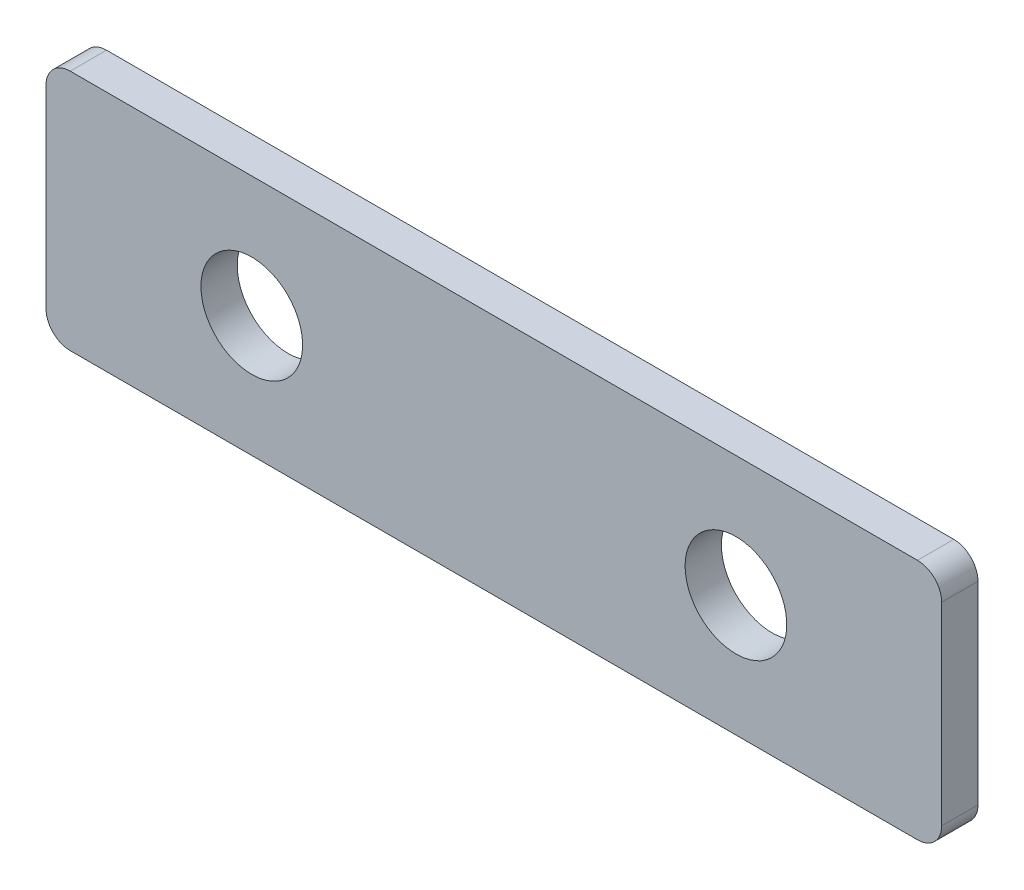
ISO-10303-21;
HEADER;
FILE_DESCRIPTION(('STEP AP214'),'2;1');
FILE_NAME('part.step','',(''),(''),'','','');
FILE_SCHEMA(('AUTOMOTIVE_DESIGN { 1 0 10303 214 1 1 1 1 }'));
ENDSEC;
DATA;
#1=APPLICATION_CONTEXT('core data for automotive mechanical design processes');
#2=APPLICATION_PROTOCOL_DEFINITION('international standard','automotive_design',2000,#1);
#3=PRODUCT_CONTEXT('',#1,'mechanical');
#4=PRODUCT('Part','Part','',(#3));
#5=PRODUCT_RELATED_PRODUCT_CATEGORY('part','',(#4));
#6=PRODUCT_DEFINITION_FORMATION('','',#4);
#7=PRODUCT_DEFINITION_CONTEXT('part definition',#1,'design');
#8=PRODUCT_DEFINITION('design','',#6,#7);
#9=PRODUCT_DEFINITION_SHAPE('','',#8);
#10=(LENGTH_UNIT() NAMED_UNIT(*) SI_UNIT(.MILLI.,.METRE.));
#11=(NAMED_UNIT(*) PLANE_ANGLE_UNIT() SI_UNIT($,.RADIAN.));
#12=(NAMED_UNIT(*) SI_UNIT($,.STERADIAN.) SOLID_ANGLE_UNIT());
#13=UNCERTAINTY_MEASURE_WITH_UNIT(LENGTH_MEASURE(1.E-05),#10,'distance_accuracy_value','');
#14=(GEOMETRIC_REPRESENTATION_CONTEXT(3) GLOBAL_UNCERTAINTY_ASSIGNED_CONTEXT((#13)) GLOBAL_UNIT_ASSIGNED_CONTEXT((#10,
#11,#12)) REPRESENTATION_CONTEXT('',''));
#15=CARTESIAN_POINT('',(0.,0.,0.));
#16=DIRECTION('',(0.,0.,1.));
#17=DIRECTION('',(1.,0.,0.));
#18=AXIS2_PLACEMENT_3D('',#15,#16,#17);
#19=CARTESIAN_POINT('',(17.4999999999999,3.99999999999973,1.5));
#20=DIRECTION('',(0.,0.,-0.999999999999995));
#21=DIRECTION('',(-1.,0.,0.));
#22=AXIS2_PLACEMENT_3D('',#19,#20,#21);
#23=PLANE('',#22);
#24=CARTESIAN_POINT('',(17.4999999999999,3.99999999999973,1.5));
#25=DIRECTION('',(0.,0.,0.999999999999995));
#26=DIRECTION('',(-1.,0.,0.));
#27=AXIS2_PLACEMENT_3D('',#24,#25,#26);
#28=CIRCLE('',#27,1.);
#29=CARTESIAN_POINT('',(18.4999999999999,3.99999999999964,1.49999999999986));
#30=VERTEX_POINT('',#29);
#31=CARTESIAN_POINT('',(17.5,4.99999999999973,1.5));
#32=VERTEX_POINT('',#31);
#33=EDGE_CURVE('E142',#30,#32,#28,.T.);
#34=ORIENTED_EDGE('',*,*,#33,.T.);
#35=DIRECTION('',(-1.,0.,0.));
#36=VECTOR('',#35,1.);
#37=CARTESIAN_POINT('',(-17.5,5.00000000000009,1.49999999999992));
#38=LINE('',#37,#36);
#39=CARTESIAN_POINT('',(-17.5,5.00000000000009,1.49999999999992));
#40=VERTEX_POINT('',#39);
#41=EDGE_CURVE('E90',#32,#40,#38,.T.);
#42=ORIENTED_EDGE('',*,*,#41,.T.);
#43=CARTESIAN_POINT('',(-17.5000000000002,4.00000000000009,1.5));
#44=DIRECTION('',(0.,0.,0.999999999999995));
#45=DIRECTION('',(-1.,0.,0.));
#46=AXIS2_PLACEMENT_3D('',#43,#44,#45);
#47=CIRCLE('',#46,1.);
#48=CARTESIAN_POINT('',(-18.5000000000002,3.99999999999992,1.50000000000003));
#49=VERTEX_POINT('',#48);
#50=EDGE_CURVE('E157',#40,#49,#47,.T.);
#51=ORIENTED_EDGE('',*,*,#50,.T.);
#52=DIRECTION('',(0.,-0.999999999999999,0.));
#53=VECTOR('',#52,1.);
#54=CARTESIAN_POINT('',(-18.5000000000001,-4.00000000000009,1.50000000000022));
#55=LINE('',#54,#53);
#56=CARTESIAN_POINT('',(-18.5000000000001,-4.00000000000009,1.50000000000022));
#57=VERTEX_POINT('',#56);
#58=EDGE_CURVE('E170',#49,#57,#55,.T.);
#59=ORIENTED_EDGE('',*,*,#58,.T.);
#60=CARTESIAN_POINT('',(-17.5000000000001,-3.99999999999992,1.50000000000008));
#61=DIRECTION('',(0.,0.,0.999999999999995));
#62=DIRECTION('',(-1.,0.,0.));
#63=AXIS2_PLACEMENT_3D('',#60,#61,#62);
#64=CIRCLE('',#63,1.);
#65=CARTESIAN_POINT('',(-17.5,-4.99999999999992,1.5));
#66=VERTEX_POINT('',#65);
#67=EDGE_CURVE('E109',#57,#66,#64,.T.);
#68=ORIENTED_EDGE('',*,*,#67,.T.);
#69=DIRECTION('',(1.,0.,0.));
#70=VECTOR('',#69,1.);
#71=CARTESIAN_POINT('',(-17.5,-4.99999999999992,1.5));
#72=LINE('',#71,#70);
#73=CARTESIAN_POINT('',(17.5,-5.00000000000028,1.50000000000008));
#74=VERTEX_POINT('',#73);
#75=EDGE_CURVE('E103',#66,#74,#72,.T.);
#76=ORIENTED_EDGE('',*,*,#75,.T.);
#77=CARTESIAN_POINT('',(17.5,-4.00000000000028,1.50000000000008));
#78=DIRECTION('',(0.,0.,0.999999999999995));
#79=DIRECTION('',(-1.,0.,0.));
#80=AXIS2_PLACEMENT_3D('',#77,#78,#79);
#81=CIRCLE('',#80,1.);
#82=CARTESIAN_POINT('',(18.5,-4.00000000000036,1.50000000000005));
#83=VERTEX_POINT('',#82);
#84=EDGE_CURVE('E107',#74,#83,#81,.T.);
#85=ORIENTED_EDGE('',*,*,#84,.T.);
#86=DIRECTION('',(0.,0.999999999999999,0.));
#87=VECTOR('',#86,1.);
#88=CARTESIAN_POINT('',(18.5,-4.00000000000036,1.50000000000005));
#89=LINE('',#88,#87);
#90=EDGE_CURVE('E47',#83,#30,#89,.T.);
#91=ORIENTED_EDGE('',*,*,#90,.T.);
#92=EDGE_LOOP('',(#34,#42,#51,#59,#68,#76,#85,#91));
#93=FACE_BOUND('',#92,.T.);
#94=CARTESIAN_POINT('',(-10.,0.,1.50000000000008));
#95=DIRECTION('',(0.,0.,0.999999999999995));
#96=DIRECTION('',(1.,0.,0.));
#97=AXIS2_PLACEMENT_3D('',#94,#95,#96);
#98=CIRCLE('',#97,2.1);
#99=CARTESIAN_POINT('',(-12.1,0.,1.50000000000008));
#100=VERTEX_POINT('',#99);
#101=EDGE_CURVE('E131',#100,#100,#98,.T.);
#102=ORIENTED_EDGE('',*,*,#101,.F.);
#103=EDGE_LOOP('',(#102));
#104=FACE_BOUND('',#103,.T.);
#105=CARTESIAN_POINT('',(10.,0.,1.5));
#106=DIRECTION('',(0.,0.,0.999999999999995));
#107=DIRECTION('',(1.,0.,0.));
#108=AXIS2_PLACEMENT_3D('',#105,#106,#107);
#109=CIRCLE('',#108,2.1);
#110=CARTESIAN_POINT('',(7.9,0.,1.5));
#111=VERTEX_POINT('',#110);
#112=EDGE_CURVE('E179',#111,#111,#109,.T.);
#113=ORIENTED_EDGE('',*,*,#112,.F.);
#114=EDGE_LOOP('',(#113));
#115=FACE_BOUND('',#114,.T.);
#116=ADVANCED_FACE('F30',(#93,#104,#115),#23,.F.);
#117=CARTESIAN_POINT('',(17.4999999999999,3.99999999999967,0.));
#118=DIRECTION('',(0.,0.,-0.999999999999995));
#119=DIRECTION('',(-1.,0.,0.));
#120=AXIS2_PLACEMENT_3D('',#117,#118,#119);
#121=PLANE('',#120);
#122=CARTESIAN_POINT('',(-10.,-1.66533453693773E-13,0.));
#123=DIRECTION('',(0.,0.,0.999999999999995));
#124=DIRECTION('',(1.,0.,0.));
#125=AXIS2_PLACEMENT_3D('',#122,#123,#124);
#126=CIRCLE('',#125,2.1);
#127=CARTESIAN_POINT('',(-12.1,0.,0.));
#128=VERTEX_POINT('',#127);
#129=EDGE_CURVE('E176',#128,#128,#126,.T.);
#130=ORIENTED_EDGE('',*,*,#129,.T.);
#131=EDGE_LOOP('',(#130));
#132=FACE_BOUND('',#131,.T.);
#133=CARTESIAN_POINT('',(17.4999999999999,3.99999999999967,0.));
#134=DIRECTION('',(0.,0.,0.999999999999995));
#135=DIRECTION('',(-1.,0.,0.));
#136=AXIS2_PLACEMENT_3D('',#133,#134,#135);
#137=CIRCLE('',#136,1.);
#138=CARTESIAN_POINT('',(18.4999999999999,3.99999999999975,-1.38777878078145E-13));
#139=VERTEX_POINT('',#138);
#140=CARTESIAN_POINT('',(17.5,4.99999999999967,0.));
#141=VERTEX_POINT('',#140);
#142=EDGE_CURVE('E127',#139,#141,#137,.T.);
#143=ORIENTED_EDGE('',*,*,#142,.F.);
#144=DIRECTION('',(0.,0.999999999999999,0.));
#145=VECTOR('',#144,1.);
#146=CARTESIAN_POINT('',(18.5,-4.00000000000025,0.));
#147=LINE('',#146,#145);
#148=CARTESIAN_POINT('',(18.5,-4.00000000000025,0.));
#149=VERTEX_POINT('',#148);
#150=EDGE_CURVE('E82',#149,#139,#147,.T.);
#151=ORIENTED_EDGE('',*,*,#150,.F.);
#152=CARTESIAN_POINT('',(17.5,-4.00000000000034,1.17961196366423E-13));
#153=DIRECTION('',(0.,0.,0.999999999999995));
#154=DIRECTION('',(-1.,0.,0.));
#155=AXIS2_PLACEMENT_3D('',#152,#153,#154);
#156=CIRCLE('',#155,1.);
#157=CARTESIAN_POINT('',(17.5,-5.00000000000034,0.));
#158=VERTEX_POINT('',#157);
#159=EDGE_CURVE('E76',#158,#149,#156,.T.);
#160=ORIENTED_EDGE('',*,*,#159,.F.);
#161=DIRECTION('',(1.,0.,0.));
#162=VECTOR('',#161,1.);
#163=CARTESIAN_POINT('',(-17.5,-4.99999999999984,0.));
#164=LINE('',#163,#162);
#165=CARTESIAN_POINT('',(-17.5,-4.99999999999984,0.));
#166=VERTEX_POINT('',#165);
#167=EDGE_CURVE('E117',#166,#158,#164,.T.);
#168=ORIENTED_EDGE('',*,*,#167,.F.);
#169=CARTESIAN_POINT('',(-17.5000000000001,-3.99999999999984,0.));
#170=DIRECTION('',(0.,0.,0.999999999999995));
#171=DIRECTION('',(-1.,0.,0.));
#172=AXIS2_PLACEMENT_3D('',#169,#170,#171);
#173=CIRCLE('',#172,1.);
#174=CARTESIAN_POINT('',(-18.5000000000001,-4.,2.56739074444567E-13));
#175=VERTEX_POINT('',#174);
#176=EDGE_CURVE('E137',#175,#166,#173,.T.);
#177=ORIENTED_EDGE('',*,*,#176,.F.);
#178=DIRECTION('',(0.,-0.999999999999999,0.));
#179=VECTOR('',#178,1.);
#180=CARTESIAN_POINT('',(-18.5000000000001,-4.,2.56739074444567E-13));
#181=LINE('',#180,#179);
#182=CARTESIAN_POINT('',(-18.5000000000002,4.,0.));
#183=VERTEX_POINT('',#182);
#184=EDGE_CURVE('E135',#183,#175,#181,.T.);
#185=ORIENTED_EDGE('',*,*,#184,.F.);
#186=CARTESIAN_POINT('',(-17.5000000000002,4.00000000000017,0.));
#187=DIRECTION('',(0.,0.,0.999999999999995));
#188=DIRECTION('',(-1.,0.,0.));
#189=AXIS2_PLACEMENT_3D('',#186,#187,#188);
#190=CIRCLE('',#189,1.);
#191=CARTESIAN_POINT('',(-17.5,5.00000000000017,0.));
#192=VERTEX_POINT('',#191);
#193=EDGE_CURVE('E133',#192,#183,#190,.T.);
#194=ORIENTED_EDGE('',*,*,#193,.F.);
#195=DIRECTION('',(-1.,0.,0.));
#196=VECTOR('',#195,1.);
#197=CARTESIAN_POINT('',(-17.5,5.00000000000017,0.));
#198=LINE('',#197,#196);
#199=EDGE_CURVE('E130',#141,#192,#198,.T.);
#200=ORIENTED_EDGE('',*,*,#199,.F.);
#201=EDGE_LOOP('',(#143,#151,#160,#168,#177,#185,#194,#200));
#202=FACE_BOUND('',#201,.T.);
#203=CARTESIAN_POINT('',(10.,0.,0.));
#204=DIRECTION('',(0.,0.,0.999999999999995));
#205=DIRECTION('',(1.,0.,0.));
#206=AXIS2_PLACEMENT_3D('',#203,#204,#205);
#207=CIRCLE('',#206,2.1);
#208=CARTESIAN_POINT('',(7.9,0.,0.));
#209=VERTEX_POINT('',#208);
#210=EDGE_CURVE('E182',#209,#209,#207,.T.);
#211=ORIENTED_EDGE('',*,*,#210,.T.);
#212=EDGE_LOOP('',(#211));
#213=FACE_BOUND('',#212,.T.);
#214=ADVANCED_FACE('F161',(#132,#202,#213),#121,.T.);
#215=CARTESIAN_POINT('',(17.4999999999999,3.99999999999973,1.5));
#216=DIRECTION('',(0.,0.,-0.999999999999995));
#217=DIRECTION('',(-1.,0.,0.));
#218=AXIS2_PLACEMENT_3D('',#215,#216,#217);
#219=CYLINDRICAL_SURFACE('',#218,1.);
#220=ORIENTED_EDGE('',*,*,#142,.T.);
#221=DIRECTION('',(0.,0.,-0.999999999999995));
#222=VECTOR('',#221,1.);
#223=CARTESIAN_POINT('',(17.5,4.99999999999973,1.5));
#224=LINE('',#223,#222);
#225=EDGE_CURVE('E11',#32,#141,#224,.T.);
#226=ORIENTED_EDGE('',*,*,#225,.F.);
#227=ORIENTED_EDGE('',*,*,#33,.F.);
#228=DIRECTION('',(0.,0.,-0.999999999999995));
#229=VECTOR('',#228,1.);
#230=CARTESIAN_POINT('',(18.4999999999999,3.99999999999964,1.49999999999986));
#231=LINE('',#230,#229);
#232=EDGE_CURVE('E123',#30,#139,#231,.T.);
#233=ORIENTED_EDGE('',*,*,#232,.T.);
#234=EDGE_LOOP('',(#220,#226,#227,#233));
#235=FACE_BOUND('',#234,.T.);
#236=ADVANCED_FACE('F32',(#235),#219,.T.);
#237=CARTESIAN_POINT('',(-17.5,5.00000000000009,1.49999999999992));
#238=DIRECTION('',(0.,-0.999999999999999,0.));
#239=DIRECTION('',(0.,0.,-0.999999999999995));
#240=AXIS2_PLACEMENT_3D('',#237,#238,#239);
#241=PLANE('',#240);
#242=ORIENTED_EDGE('',*,*,#199,.T.);
#243=DIRECTION('',(0.,0.,-0.999999999999995));
#244=VECTOR('',#243,1.);
#245=CARTESIAN_POINT('',(-17.5,5.00000000000009,1.49999999999992));
#246=LINE('',#245,#244);
#247=EDGE_CURVE('E39',#40,#192,#246,.T.);
#248=ORIENTED_EDGE('',*,*,#247,.F.);
#249=ORIENTED_EDGE('',*,*,#41,.F.);
#250=ORIENTED_EDGE('',*,*,#225,.T.);
#251=EDGE_LOOP('',(#242,#248,#249,#250));
#252=FACE_BOUND('',#251,.T.);
#253=ADVANCED_FACE('F214',(#252),#241,.F.);
#254=CARTESIAN_POINT('',(-17.5000000000002,4.00000000000009,1.5));
#255=DIRECTION('',(0.,0.,-0.999999999999995));
#256=DIRECTION('',(-1.,0.,0.));
#257=AXIS2_PLACEMENT_3D('',#254,#255,#256);
#258=CYLINDRICAL_SURFACE('',#257,1.);
#259=ORIENTED_EDGE('',*,*,#193,.T.);
#260=DIRECTION('',(0.,0.,-0.999999999999995));
#261=VECTOR('',#260,1.);
#262=CARTESIAN_POINT('',(-18.5000000000002,3.99999999999992,1.50000000000003));
#263=LINE('',#262,#261);
#264=EDGE_CURVE('E149',#49,#183,#263,.T.);
#265=ORIENTED_EDGE('',*,*,#264,.F.);
#266=ORIENTED_EDGE('',*,*,#50,.F.);
#267=ORIENTED_EDGE('',*,*,#247,.T.);
#268=EDGE_LOOP('',(#259,#265,#266,#267));
#269=FACE_BOUND('',#268,.T.);
#270=ADVANCED_FACE('F155',(#269),#258,.T.);
#271=CARTESIAN_POINT('',(-18.5000000000001,-4.00000000000009,1.50000000000022));
#272=DIRECTION('',(1.,0.,0.));
#273=DIRECTION('',(0.,0.,-0.999999999999995));
#274=AXIS2_PLACEMENT_3D('',#271,#272,#273);
#275=PLANE('',#274);
#276=ORIENTED_EDGE('',*,*,#184,.T.);
#277=DIRECTION('',(0.,0.,-0.999999999999995));
#278=VECTOR('',#277,1.);
#279=CARTESIAN_POINT('',(-18.5000000000001,-4.00000000000009,1.50000000000022));
#280=LINE('',#279,#278);
#281=EDGE_CURVE('E146',#57,#175,#280,.T.);
#282=ORIENTED_EDGE('',*,*,#281,.F.);
#283=ORIENTED_EDGE('',*,*,#58,.F.);
#284=ORIENTED_EDGE('',*,*,#264,.T.);
#285=EDGE_LOOP('',(#276,#282,#283,#284));
#286=FACE_BOUND('',#285,.T.);
#287=ADVANCED_FACE('F166',(#286),#275,.F.);
#288=CARTESIAN_POINT('',(-17.5000000000001,-3.99999999999992,1.50000000000008));
#289=DIRECTION('',(0.,0.,-0.999999999999995));
#290=DIRECTION('',(-1.,0.,0.));
#291=AXIS2_PLACEMENT_3D('',#288,#289,#290);
#292=CYLINDRICAL_SURFACE('',#291,1.);
#293=ORIENTED_EDGE('',*,*,#176,.T.);
#294=DIRECTION('',(0.,0.,-0.999999999999995));
#295=VECTOR('',#294,1.);
#296=CARTESIAN_POINT('',(-17.5,-4.99999999999992,1.5));
#297=LINE('',#296,#295);
#298=EDGE_CURVE('E118',#66,#166,#297,.T.);
#299=ORIENTED_EDGE('',*,*,#298,.F.);
#300=ORIENTED_EDGE('',*,*,#67,.F.);
#301=ORIENTED_EDGE('',*,*,#281,.T.);
#302=EDGE_LOOP('',(#293,#299,#300,#301));
#303=FACE_BOUND('',#302,.T.);
#304=ADVANCED_FACE('F169',(#303),#292,.T.);
#305=CARTESIAN_POINT('',(-17.5,-4.99999999999992,1.5));
#306=DIRECTION('',(0.,0.999999999999999,0.));
#307=DIRECTION('',(0.,0.,0.999999999999995));
#308=AXIS2_PLACEMENT_3D('',#305,#306,#307);
#309=PLANE('',#308);
#310=ORIENTED_EDGE('',*,*,#167,.T.);
#311=DIRECTION('',(0.,0.,-0.999999999999995));
#312=VECTOR('',#311,1.);
#313=CARTESIAN_POINT('',(17.5,-5.00000000000028,1.50000000000008));
#314=LINE('',#313,#312);
#315=EDGE_CURVE('E114',#74,#158,#314,.T.);
#316=ORIENTED_EDGE('',*,*,#315,.F.);
#317=ORIENTED_EDGE('',*,*,#75,.F.);
#318=ORIENTED_EDGE('',*,*,#298,.T.);
#319=EDGE_LOOP('',(#310,#316,#317,#318));
#320=FACE_BOUND('',#319,.T.);
#321=ADVANCED_FACE('F115',(#320),#309,.F.);
#322=CARTESIAN_POINT('',(17.5,-4.00000000000028,1.50000000000008));
#323=DIRECTION('',(0.,0.,-0.999999999999995));
#324=DIRECTION('',(-1.,0.,0.));
#325=AXIS2_PLACEMENT_3D('',#322,#323,#324);
#326=CYLINDRICAL_SURFACE('',#325,1.);
#327=ORIENTED_EDGE('',*,*,#159,.T.);
#328=DIRECTION('',(0.,0.,-0.999999999999995));
#329=VECTOR('',#328,1.);
#330=CARTESIAN_POINT('',(18.5,-4.00000000000036,1.50000000000005));
#331=LINE('',#330,#329);
#332=EDGE_CURVE('E119',#83,#149,#331,.T.);
#333=ORIENTED_EDGE('',*,*,#332,.F.);
#334=ORIENTED_EDGE('',*,*,#84,.F.);
#335=ORIENTED_EDGE('',*,*,#315,.T.);
#336=EDGE_LOOP('',(#327,#333,#334,#335));
#337=FACE_BOUND('',#336,.T.);
#338=ADVANCED_FACE('F121',(#337),#326,.T.);
#339=CARTESIAN_POINT('',(18.5,-4.00000000000036,1.50000000000005));
#340=DIRECTION('',(-1.,0.,0.));
#341=DIRECTION('',(0.,0.,0.999999999999995));
#342=AXIS2_PLACEMENT_3D('',#339,#340,#341);
#343=PLANE('',#342);
#344=ORIENTED_EDGE('',*,*,#150,.T.);
#345=ORIENTED_EDGE('',*,*,#232,.F.);
#346=ORIENTED_EDGE('',*,*,#90,.F.);
#347=ORIENTED_EDGE('',*,*,#332,.T.);
#348=EDGE_LOOP('',(#344,#345,#346,#347));
#349=FACE_BOUND('',#348,.T.);
#350=ADVANCED_FACE('F202',(#349),#343,.F.);
#351=CARTESIAN_POINT('',(-10.,0.,1.50000000000008));
#352=DIRECTION('',(0.,0.,-0.999999999999995));
#353=DIRECTION('',(-1.,0.,0.));
#354=AXIS2_PLACEMENT_3D('',#351,#352,#353);
#355=CYLINDRICAL_SURFACE('',#354,2.1);
#356=CARTESIAN_POINT('',(-12.1,0.,1.50000000000008));
#357=CARTESIAN_POINT('',(-12.1,0.,1.48437500000008));
#358=CARTESIAN_POINT('',(-12.1,0.,1.46875000000008));
#359=CARTESIAN_POINT('',(-12.1,0.,1.43750000000008));
#360=CARTESIAN_POINT('',(-12.1,0.,1.42187500000009));
#361=CARTESIAN_POINT('',(-12.1,0.,1.39062500000009));
#362=CARTESIAN_POINT('',(-12.1,0.,1.37500000000009));
#363=CARTESIAN_POINT('',(-12.1,0.,1.34375000000009));
#364=CARTESIAN_POINT('',(-12.1,0.,1.32812500000009));
#365=CARTESIAN_POINT('',(-12.1,0.,1.29687500000009));
#366=CARTESIAN_POINT('',(-12.1,0.,1.28125000000009));
#367=CARTESIAN_POINT('',(-12.1,0.,1.25000000000009));
#368=CARTESIAN_POINT('',(-12.1,0.,1.23437500000009));
#369=CARTESIAN_POINT('',(-12.1,0.,1.20312500000009));
#370=CARTESIAN_POINT('',(-12.1,0.,1.18750000000009));
#371=CARTESIAN_POINT('',(-12.1,0.,1.15625000000009));
#372=CARTESIAN_POINT('',(-12.1,0.,1.14062500000009));
#373=CARTESIAN_POINT('',(-12.1,0.,1.10937500000009));
#374=CARTESIAN_POINT('',(-12.1,0.,1.09375000000009));
#375=CARTESIAN_POINT('',(-12.1,0.,1.06250000000009));
#376=CARTESIAN_POINT('',(-12.1,0.,1.04687500000009));
#377=CARTESIAN_POINT('',(-12.1,0.,1.01562500000009));
#378=CARTESIAN_POINT('',(-12.1,0.,1.00000000000009));
#379=CARTESIAN_POINT('',(-12.1,0.,0.968750000000087));
#380=CARTESIAN_POINT('',(-12.1,0.,0.953125000000087));
#381=CARTESIAN_POINT('',(-12.1,0.,0.921875000000087));
#382=CARTESIAN_POINT('',(-12.1,0.,0.906250000000087));
#383=CARTESIAN_POINT('',(-12.1,0.,0.875000000000087));
#384=CARTESIAN_POINT('',(-12.1,0.,0.859375000000087));
#385=CARTESIAN_POINT('',(-12.1,0.,0.828125000000087));
#386=CARTESIAN_POINT('',(-12.1,0.,0.812500000000087));
#387=CARTESIAN_POINT('',(-12.1,0.,0.781250000000087));
#388=CARTESIAN_POINT('',(-12.1,0.,0.765625000000087));
#389=CARTESIAN_POINT('',(-12.1,0.,0.734375000000087));
#390=CARTESIAN_POINT('',(-12.1,0.,0.718750000000087));
#391=CARTESIAN_POINT('',(-12.1,0.,0.687500000000088));
#392=CARTESIAN_POINT('',(-12.1,0.,0.671875000000088));
#393=CARTESIAN_POINT('',(-12.1,0.,0.640625000000088));
#394=CARTESIAN_POINT('',(-12.1,0.,0.625000000000088));
#395=CARTESIAN_POINT('',(-12.1,0.,0.593750000000088));
#396=CARTESIAN_POINT('',(-12.1,0.,0.578125000000088));
#397=CARTESIAN_POINT('',(-12.1,0.,0.546875000000088));
#398=CARTESIAN_POINT('',(-12.1,0.,0.531250000000088));
#399=CARTESIAN_POINT('',(-12.1,0.,0.500000000000088));
#400=CARTESIAN_POINT('',(-12.1,0.,0.484375000000088));
#401=CARTESIAN_POINT('',(-12.1,0.,0.453125000000088));
#402=CARTESIAN_POINT('',(-12.1,0.,0.437500000000089));
#403=CARTESIAN_POINT('',(-12.1,0.,0.406250000000089));
#404=CARTESIAN_POINT('',(-12.1,0.,0.390625000000089));
#405=CARTESIAN_POINT('',(-12.1,0.,0.359375000000089));
#406=CARTESIAN_POINT('',(-12.1,0.,0.343750000000089));
#407=CARTESIAN_POINT('',(-12.1,0.,0.312500000000089));
#408=CARTESIAN_POINT('',(-12.1,0.,0.296875000000089));
#409=CARTESIAN_POINT('',(-12.1,0.,0.265625000000089));
#410=CARTESIAN_POINT('',(-12.1,0.,0.250000000000089));
#411=CARTESIAN_POINT('',(-12.1,0.,0.218750000000089));
#412=CARTESIAN_POINT('',(-12.1,0.,0.203125000000089));
#413=CARTESIAN_POINT('',(-12.1,0.,0.17187500000009));
#414=CARTESIAN_POINT('',(-12.1,0.,0.15625000000009));
#415=CARTESIAN_POINT('',(-12.1,0.,0.12500000000009));
#416=CARTESIAN_POINT('',(-12.1,0.,0.10937500000009));
#417=CARTESIAN_POINT('',(-12.1,0.,0.0781250000000899));
#418=CARTESIAN_POINT('',(-12.1,0.,0.06250000000009));
#419=CARTESIAN_POINT('',(-12.1,0.,0.0312500000000901));
#420=CARTESIAN_POINT('',(-12.1,0.,0.0156250000000902));
#421=CARTESIAN_POINT('',(-12.1,0.,0.));
#422=B_SPLINE_CURVE_WITH_KNOTS('',3,(#356,#357,#358,#359,#360,#361,#362,#363,#364,#365,#366,
#367,#368,#369,#370,#371,#372,#373,#374,#375,#376,#377,#378,#379,#380,#381,#382,#383,#384,#385,
#386,#387,#388,#389,#390,#391,#392,#393,#394,#395,#396,#397,#398,#399,#400,#401,#402,#403,#404,
#405,#406,#407,#408,#409,#410,#411,#412,#413,#414,#415,#416,#417,#418,#419,#420,#421),
.UNSPECIFIED.,.F.,.F.,(4,2,2,2,2,2,2,2,2,2,2,2,2,2,2,2,2,2,2,2,2,2,2,2,2,2,2,2,2,2,2,2,4),(0.,
0.0468749999999996,0.0937499999999994,0.140624999999999,0.187499999999999,0.234374999999999,
0.281249999999999,0.328124999999999,0.374999999999998,0.421874999999998,0.468749999999998,
0.515624999999998,0.562499999999998,0.609374999999998,0.656249999999997,0.703124999999997,
0.749999999999997,0.796874999999997,0.843749999999997,0.890624999999996,0.937499999999996,
0.984374999999996,1.03125,1.078125,1.125,1.171875,1.21875,1.265625,1.31249999999999,
1.35937499999999,1.40624999999999,1.45312499999999,1.49999999999999),.UNSPECIFIED.);
#423=EDGE_CURVE('BSEAM199',#100,#128,#422,.T.);
#424=ORIENTED_EDGE('',*,*,#101,.T.);
#425=ORIENTED_EDGE('',*,*,#129,.F.);
#426=ORIENTED_EDGE('',*,*,#423,.T.);
#427=ORIENTED_EDGE('',*,*,#423,.F.);
#428=EDGE_LOOP('',(#424,#426,#425,#427));
#429=FACE_BOUND('',#428,.T.);
#430=ADVANCED_FACE('F199',(#429),#355,.F.);
#431=CARTESIAN_POINT('',(10.,0.,1.5));
#432=DIRECTION('',(0.,0.,-0.999999999999995));
#433=DIRECTION('',(-1.,0.,0.));
#434=AXIS2_PLACEMENT_3D('',#431,#432,#433);
#435=CYLINDRICAL_SURFACE('',#434,2.1);
#436=CARTESIAN_POINT('',(7.9,0.,1.5));
#437=CARTESIAN_POINT('',(7.9,0.,1.484375));
#438=CARTESIAN_POINT('',(7.9,0.,1.46875));
#439=CARTESIAN_POINT('',(7.9,0.,1.4375));
#440=CARTESIAN_POINT('',(7.9,0.,1.421875));
#441=CARTESIAN_POINT('',(7.9,0.,1.390625));
#442=CARTESIAN_POINT('',(7.9,0.,1.375));
#443=CARTESIAN_POINT('',(7.9,0.,1.34375));
#444=CARTESIAN_POINT('',(7.9,0.,1.328125));
#445=CARTESIAN_POINT('',(7.9,0.,1.296875));
#446=CARTESIAN_POINT('',(7.9,0.,1.28125));
#447=CARTESIAN_POINT('',(7.9,0.,1.25));
#448=CARTESIAN_POINT('',(7.9,0.,1.234375));
#449=CARTESIAN_POINT('',(7.9,0.,1.203125));
#450=CARTESIAN_POINT('',(7.9,0.,1.1875));
#451=CARTESIAN_POINT('',(7.9,0.,1.15625));
#452=CARTESIAN_POINT('',(7.9,0.,1.140625));
#453=CARTESIAN_POINT('',(7.9,0.,1.109375));
#454=CARTESIAN_POINT('',(7.9,0.,1.09375));
#455=CARTESIAN_POINT('',(7.9,0.,1.0625));
#456=CARTESIAN_POINT('',(7.9,0.,1.046875));
#457=CARTESIAN_POINT('',(7.9,0.,1.015625));
#458=CARTESIAN_POINT('',(7.9,0.,0.999999999999999));
#459=CARTESIAN_POINT('',(7.9,0.,0.968749999999999));
#460=CARTESIAN_POINT('',(7.9,0.,0.953124999999999));
#461=CARTESIAN_POINT('',(7.9,0.,0.921874999999999));
#462=CARTESIAN_POINT('',(7.9,0.,0.906249999999999));
#463=CARTESIAN_POINT('',(7.9,0.,0.874999999999999));
#464=CARTESIAN_POINT('',(7.9,0.,0.859374999999999));
#465=CARTESIAN_POINT('',(7.9,0.,0.828124999999999));
#466=CARTESIAN_POINT('',(7.9,0.,0.812499999999999));
#467=CARTESIAN_POINT('',(7.9,0.,0.781249999999999));
#468=CARTESIAN_POINT('',(7.9,0.,0.765624999999999));
#469=CARTESIAN_POINT('',(7.9,0.,0.734374999999999));
#470=CARTESIAN_POINT('',(7.9,0.,0.718749999999999));
#471=CARTESIAN_POINT('',(7.9,0.,0.687499999999999));
#472=CARTESIAN_POINT('',(7.9,0.,0.671874999999999));
#473=CARTESIAN_POINT('',(7.9,0.,0.640624999999999));
#474=CARTESIAN_POINT('',(7.9,0.,0.624999999999999));
#475=CARTESIAN_POINT('',(7.9,0.,0.593749999999999));
#476=CARTESIAN_POINT('',(7.9,0.,0.578124999999999));
#477=CARTESIAN_POINT('',(7.9,0.,0.546874999999999));
#478=CARTESIAN_POINT('',(7.9,0.,0.531249999999999));
#479=CARTESIAN_POINT('',(7.9,0.,0.499999999999999));
#480=CARTESIAN_POINT('',(7.9,0.,0.484374999999999));
#481=CARTESIAN_POINT('',(7.9,0.,0.453124999999999));
#482=CARTESIAN_POINT('',(7.9,0.,0.437499999999999));
#483=CARTESIAN_POINT('',(7.9,0.,0.406249999999999));
#484=CARTESIAN_POINT('',(7.9,0.,0.390624999999999));
#485=CARTESIAN_POINT('',(7.9,0.,0.359374999999999));
#486=CARTESIAN_POINT('',(7.9,0.,0.343749999999999));
#487=CARTESIAN_POINT('',(7.9,0.,0.312499999999999));
#488=CARTESIAN_POINT('',(7.9,0.,0.296875));
#489=CARTESIAN_POINT('',(7.9,0.,0.265625));
#490=CARTESIAN_POINT('',(7.9,0.,0.25));
#491=CARTESIAN_POINT('',(7.9,0.,0.21875));
#492=CARTESIAN_POINT('',(7.9,0.,0.203125));
#493=CARTESIAN_POINT('',(7.9,0.,0.171875));
#494=CARTESIAN_POINT('',(7.9,0.,0.15625));
#495=CARTESIAN_POINT('',(7.9,0.,0.125));
#496=CARTESIAN_POINT('',(7.9,0.,0.109375));
#497=CARTESIAN_POINT('',(7.9,0.,0.0781249999999998));
#498=CARTESIAN_POINT('',(7.9,0.,0.0624999999999998));
#499=CARTESIAN_POINT('',(7.9,0.,0.0312499999999999));
#500=CARTESIAN_POINT('',(7.9,0.,0.0156249999999999));
#501=CARTESIAN_POINT('',(7.9,0.,0.));
#502=B_SPLINE_CURVE_WITH_KNOTS('',3,(#436,#437,#438,#439,#440,#441,#442,#443,#444,#445,#446,
#447,#448,#449,#450,#451,#452,#453,#454,#455,#456,#457,#458,#459,#460,#461,#462,#463,#464,#465,
#466,#467,#468,#469,#470,#471,#472,#473,#474,#475,#476,#477,#478,#479,#480,#481,#482,#483,#484,
#485,#486,#487,#488,#489,#490,#491,#492,#493,#494,#495,#496,#497,#498,#499,#500,#501),
.UNSPECIFIED.,.F.,.F.,(4,2,2,2,2,2,2,2,2,2,2,2,2,2,2,2,2,2,2,2,2,2,2,2,2,2,2,2,2,2,2,2,4),(0.,
0.0468749999999998,0.0937499999999997,0.140625,0.1875,0.234375,0.281249999999999,
0.328124999999999,0.374999999999999,0.421874999999999,0.468749999999999,0.515624999999999,
0.562499999999999,0.609374999999999,0.656249999999999,0.703124999999999,0.749999999999999,
0.796874999999999,0.843749999999999,0.890624999999999,0.937499999999998,0.984374999999998,
1.03125,1.078125,1.125,1.171875,1.21875,1.265625,1.3125,1.359375,1.40625,1.453125,1.5),.UNSPECIFIED.);
#503=EDGE_CURVE('BSEAM188',#111,#209,#502,.T.);
#504=ORIENTED_EDGE('',*,*,#112,.T.);
#505=ORIENTED_EDGE('',*,*,#210,.F.);
#506=ORIENTED_EDGE('',*,*,#503,.T.);
#507=ORIENTED_EDGE('',*,*,#503,.F.);
#508=EDGE_LOOP('',(#504,#506,#505,#507));
#509=FACE_BOUND('',#508,.T.);
#510=ADVANCED_FACE('F188',(#509),#435,.F.);
#511=CLOSED_SHELL('',(#116,#214,#236,#253,#270,#287,#304,#321,#338,#350,#430,#510));
#512=MANIFOLD_SOLID_BREP('B2',#511);
#513=ADVANCED_BREP_SHAPE_REPRESENTATION('',(#18,#512),#14);
#514=SHAPE_DEFINITION_REPRESENTATION(#9,#513);
ENDSEC;
END-ISO-10303-21;
